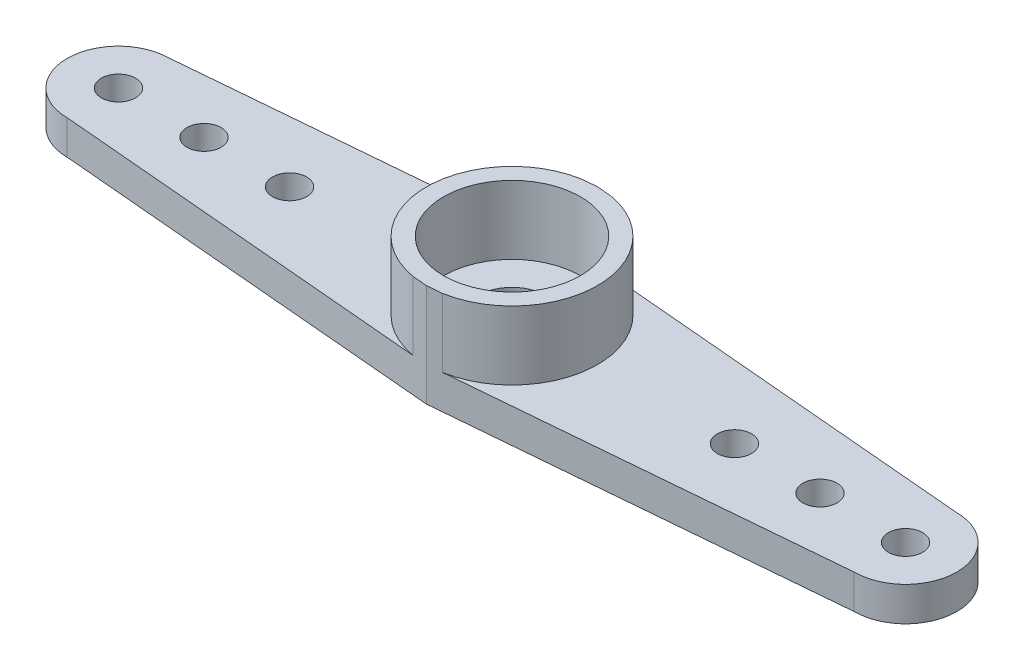
ISO-10303-21;
HEADER;
FILE_DESCRIPTION(('STEP AP214'),'2;1');
FILE_NAME('part.step','',(''),(''),'','','');
FILE_SCHEMA(('AUTOMOTIVE_DESIGN { 1 0 10303 214 1 1 1 1 }'));
ENDSEC;
DATA;
#1=APPLICATION_CONTEXT('core data for automotive mechanical design processes');
#2=APPLICATION_PROTOCOL_DEFINITION('international standard','automotive_design',2000,#1);
#3=PRODUCT_CONTEXT('',#1,'mechanical');
#4=PRODUCT('Part','Part','',(#3));
#5=PRODUCT_RELATED_PRODUCT_CATEGORY('part','',(#4));
#6=PRODUCT_DEFINITION_FORMATION('','',#4);
#7=PRODUCT_DEFINITION_CONTEXT('part definition',#1,'design');
#8=PRODUCT_DEFINITION('design','',#6,#7);
#9=PRODUCT_DEFINITION_SHAPE('','',#8);
#10=(LENGTH_UNIT() NAMED_UNIT(*) SI_UNIT(.MILLI.,.METRE.));
#11=(NAMED_UNIT(*) PLANE_ANGLE_UNIT() SI_UNIT($,.RADIAN.));
#12=(NAMED_UNIT(*) SI_UNIT($,.STERADIAN.) SOLID_ANGLE_UNIT());
#13=UNCERTAINTY_MEASURE_WITH_UNIT(LENGTH_MEASURE(1.E-05),#10,'distance_accuracy_value','');
#14=(GEOMETRIC_REPRESENTATION_CONTEXT(3) GLOBAL_UNCERTAINTY_ASSIGNED_CONTEXT((#13)) GLOBAL_UNIT_ASSIGNED_CONTEXT((#10,
#11,#12)) REPRESENTATION_CONTEXT('',''));
#15=CARTESIAN_POINT('',(0.,0.,0.));
#16=DIRECTION('',(0.,0.,1.));
#17=DIRECTION('',(1.,0.,0.));
#18=AXIS2_PLACEMENT_3D('',#15,#16,#17);
#19=CARTESIAN_POINT('',(0.,1.,0.));
#20=DIRECTION('',(0.,1.,0.));
#21=DIRECTION('',(0.,0.,1.));
#22=AXIS2_PLACEMENT_3D('',#19,#20,#21);
#23=PLANE('',#22);
#24=CARTESIAN_POINT('',(6.5,1.,0.));
#25=DIRECTION('',(0.,1.,0.));
#26=DIRECTION('',(0.,0.,1.));
#27=AXIS2_PLACEMENT_3D('',#24,#25,#26);
#28=CIRCLE('',#27,0.500000000000001);
#29=CARTESIAN_POINT('',(6.5,1.,0.500000000000001));
#30=VERTEX_POINT('',#29);
#31=EDGE_CURVE('E166',#30,#30,#28,.T.);
#32=ORIENTED_EDGE('',*,*,#31,.F.);
#33=EDGE_LOOP('',(#32));
#34=FACE_BOUND('',#33,.T.);
#35=CARTESIAN_POINT('',(9.,1.,0.));
#36=DIRECTION('',(0.,1.,0.));
#37=DIRECTION('',(0.,0.,1.));
#38=AXIS2_PLACEMENT_3D('',#35,#36,#37);
#39=CIRCLE('',#38,0.500000000000001);
#40=CARTESIAN_POINT('',(9.,1.,0.500000000000001));
#41=VERTEX_POINT('',#40);
#42=EDGE_CURVE('E169',#41,#41,#39,.T.);
#43=ORIENTED_EDGE('',*,*,#42,.F.);
#44=EDGE_LOOP('',(#43));
#45=FACE_BOUND('',#44,.T.);
#46=CARTESIAN_POINT('',(11.5,1.,0.));
#47=DIRECTION('',(0.,1.,0.));
#48=DIRECTION('',(0.,0.,1.));
#49=AXIS2_PLACEMENT_3D('',#46,#47,#48);
#50=CIRCLE('',#49,0.499999999999999);
#51=CARTESIAN_POINT('',(11.5,1.,0.499999999999999));
#52=VERTEX_POINT('',#51);
#53=EDGE_CURVE('E175',#52,#52,#50,.T.);
#54=ORIENTED_EDGE('',*,*,#53,.F.);
#55=EDGE_LOOP('',(#54));
#56=FACE_BOUND('',#55,.T.);
#57=DIRECTION('',(-0.996240588195683,0.,-0.0866296163648422));
#58=VECTOR('',#57,1.);
#59=CARTESIAN_POINT('',(0.215759849906192,1.,-2.4812382739212));
#60=LINE('',#59,#58);
#61=CARTESIAN_POINT('',(11.5,1.,-1.5));
#62=VERTEX_POINT('',#61);
#63=CARTESIAN_POINT('',(0.431519699812379,1.,-2.4624765478424));
#64=VERTEX_POINT('',#63);
#65=EDGE_CURVE('E51',#62,#64,#60,.T.);
#66=ORIENTED_EDGE('',*,*,#65,.T.);
#67=CARTESIAN_POINT('',(0.,1.,0.));
#68=DIRECTION('',(0.,1.,0.));
#69=DIRECTION('',(0.,0.,1.));
#70=AXIS2_PLACEMENT_3D('',#67,#68,#69);
#71=CIRCLE('',#70,2.5);
#72=CARTESIAN_POINT('',(0.431519699812379,1.,2.4624765478424));
#73=VERTEX_POINT('',#72);
#74=EDGE_CURVE('E55',#64,#73,#71,.F.);
#75=ORIENTED_EDGE('',*,*,#74,.T.);
#76=DIRECTION('',(0.996240588195683,0.,-0.0866296163648422));
#77=VECTOR('',#76,1.);
#78=CARTESIAN_POINT('',(0.215759849906192,1.,2.4812382739212));
#79=LINE('',#78,#77);
#80=CARTESIAN_POINT('',(11.5,1.,1.5));
#81=VERTEX_POINT('',#80);
#82=EDGE_CURVE('E136',#73,#81,#79,.T.);
#83=ORIENTED_EDGE('',*,*,#82,.T.);
#84=CARTESIAN_POINT('',(11.5,1.,0.));
#85=DIRECTION('',(0.,1.,0.));
#86=DIRECTION('',(0.,0.,1.));
#87=AXIS2_PLACEMENT_3D('',#84,#85,#86);
#88=CIRCLE('',#87,1.5);
#89=EDGE_CURVE('E154',#81,#62,#88,.T.);
#90=ORIENTED_EDGE('',*,*,#89,.T.);
#91=EDGE_LOOP('',(#66,#75,#83,#90));
#92=FACE_BOUND('',#91,.T.);
#93=ADVANCED_FACE('F35',(#34,#45,#56,#92),#23,.T.);
#94=CARTESIAN_POINT('',(-6.5,1.,0.));
#95=DIRECTION('',(0.,1.,0.));
#96=DIRECTION('',(0.,0.,1.));
#97=AXIS2_PLACEMENT_3D('',#94,#95,#96);
#98=CIRCLE('',#97,0.500000000000001);
#99=CARTESIAN_POINT('',(-6.5,1.,0.499999999999955));
#100=VERTEX_POINT('',#99);
#101=EDGE_CURVE('E157',#100,#100,#98,.T.);
#102=ORIENTED_EDGE('',*,*,#101,.F.);
#103=EDGE_LOOP('',(#102));
#104=FACE_BOUND('',#103,.T.);
#105=CARTESIAN_POINT('',(-9.,1.,0.));
#106=DIRECTION('',(0.,1.,0.));
#107=DIRECTION('',(0.,0.,1.));
#108=AXIS2_PLACEMENT_3D('',#105,#106,#107);
#109=CIRCLE('',#108,0.500000000000001);
#110=CARTESIAN_POINT('',(-9.,1.,0.499999999999939));
#111=VERTEX_POINT('',#110);
#112=EDGE_CURVE('E160',#111,#111,#109,.T.);
#113=ORIENTED_EDGE('',*,*,#112,.F.);
#114=EDGE_LOOP('',(#113));
#115=FACE_BOUND('',#114,.T.);
#116=CARTESIAN_POINT('',(-11.5,1.,0.));
#117=DIRECTION('',(0.,1.,0.));
#118=DIRECTION('',(0.,0.,1.));
#119=AXIS2_PLACEMENT_3D('',#116,#117,#118);
#120=CIRCLE('',#119,0.499999999999998);
#121=CARTESIAN_POINT('',(-11.5,1.,0.499999999999918));
#122=VERTEX_POINT('',#121);
#123=EDGE_CURVE('E163',#122,#122,#120,.T.);
#124=ORIENTED_EDGE('',*,*,#123,.F.);
#125=EDGE_LOOP('',(#124));
#126=FACE_BOUND('',#125,.T.);
#127=DIRECTION('',(0.996240588195683,0.,0.0866296163648423));
#128=VECTOR('',#127,1.);
#129=CARTESIAN_POINT('',(-0.215759849906192,1.,2.4812382739212));
#130=LINE('',#129,#128);
#131=CARTESIAN_POINT('',(-11.5,1.,1.49999999999996));
#132=VERTEX_POINT('',#131);
#133=CARTESIAN_POINT('',(-0.431519699812375,1.,2.4624765478424));
#134=VERTEX_POINT('',#133);
#135=EDGE_CURVE('E151',#132,#134,#130,.T.);
#136=ORIENTED_EDGE('',*,*,#135,.T.);
#137=CARTESIAN_POINT('',(0.,1.,0.));
#138=DIRECTION('',(0.,1.,0.));
#139=DIRECTION('',(0.,0.,1.));
#140=AXIS2_PLACEMENT_3D('',#137,#138,#139);
#141=CIRCLE('',#140,2.5);
#142=CARTESIAN_POINT('',(-0.431519699812379,1.,-2.4624765478424));
#143=VERTEX_POINT('',#142);
#144=EDGE_CURVE('E137',#134,#143,#141,.F.);
#145=ORIENTED_EDGE('',*,*,#144,.T.);
#146=DIRECTION('',(-0.996240588195683,0.,0.0866296163648421));
#147=VECTOR('',#146,1.);
#148=CARTESIAN_POINT('',(-0.215759849906192,1.,-2.4812382739212));
#149=LINE('',#148,#147);
#150=CARTESIAN_POINT('',(-11.5,1.,-1.50000000000004));
#151=VERTEX_POINT('',#150);
#152=EDGE_CURVE('E146',#143,#151,#149,.T.);
#153=ORIENTED_EDGE('',*,*,#152,.T.);
#154=CARTESIAN_POINT('',(-11.5,1.,0.));
#155=DIRECTION('',(0.,1.,0.));
#156=DIRECTION('',(0.,0.,1.));
#157=AXIS2_PLACEMENT_3D('',#154,#155,#156);
#158=CIRCLE('',#157,1.5);
#159=EDGE_CURVE('E148',#151,#132,#158,.T.);
#160=ORIENTED_EDGE('',*,*,#159,.T.);
#161=EDGE_LOOP('',(#136,#145,#153,#160));
#162=FACE_BOUND('',#161,.T.);
#163=ADVANCED_FACE('F263',(#104,#115,#126,#162),#23,.T.);
#164=CARTESIAN_POINT('',(-0.215759849906192,1.,-2.4812382739212));
#165=DIRECTION('',(0.0866296163648421,0.,0.996240588195683));
#166=DIRECTION('',(0.996240588195683,0.,-0.0866296163648421));
#167=AXIS2_PLACEMENT_3D('',#164,#165,#166);
#168=PLANE('',#167);
#169=DIRECTION('',(-0.996240588195683,0.,0.0866296163648421));
#170=VECTOR('',#169,1.);
#171=CARTESIAN_POINT('',(-0.215759849906192,0.,-2.4812382739212));
#172=LINE('',#171,#170);
#173=CARTESIAN_POINT('',(0.,0.,-2.5));
#174=VERTEX_POINT('',#173);
#175=CARTESIAN_POINT('',(-11.5,0.,-1.50000000000004));
#176=VERTEX_POINT('',#175);
#177=EDGE_CURVE('E145',#174,#176,#172,.T.);
#178=ORIENTED_EDGE('',*,*,#177,.T.);
#179=DIRECTION('',(0.,-1.,0.));
#180=VECTOR('',#179,1.);
#181=CARTESIAN_POINT('',(-11.5,1.,-1.50000000000004));
#182=LINE('',#181,#180);
#183=EDGE_CURVE('E39',#151,#176,#182,.T.);
#184=ORIENTED_EDGE('',*,*,#183,.F.);
#185=ORIENTED_EDGE('',*,*,#152,.F.);
#186=DIRECTION('',(0.,-1.,0.));
#187=VECTOR('',#186,1.);
#188=CARTESIAN_POINT('',(-0.431519699812379,3.,-2.4624765478424));
#189=LINE('',#188,#187);
#190=CARTESIAN_POINT('',(-0.431519699812379,3.,-2.4624765478424));
#191=VERTEX_POINT('',#190);
#192=EDGE_CURVE('E140',#191,#143,#189,.T.);
#193=ORIENTED_EDGE('',*,*,#192,.F.);
#194=DIRECTION('',(-0.996240588195683,0.,0.0866296163648421));
#195=VECTOR('',#194,1.);
#196=CARTESIAN_POINT('',(-0.215759849906192,3.,-2.4812382739212));
#197=LINE('',#196,#195);
#198=CARTESIAN_POINT('',(0.,3.,-2.5));
#199=VERTEX_POINT('',#198);
#200=EDGE_CURVE('E250',#199,#191,#197,.T.);
#201=ORIENTED_EDGE('',*,*,#200,.F.);
#202=DIRECTION('',(0.,-1.,0.));
#203=VECTOR('',#202,1.);
#204=CARTESIAN_POINT('',(0.,1.,-2.5));
#205=LINE('',#204,#203);
#206=EDGE_CURVE('E178',#199,#174,#205,.T.);
#207=ORIENTED_EDGE('',*,*,#206,.T.);
#208=EDGE_LOOP('',(#178,#184,#185,#193,#201,#207));
#209=FACE_BOUND('',#208,.T.);
#210=ADVANCED_FACE('F37',(#209),#168,.F.);
#211=CARTESIAN_POINT('',(-11.5,1.,0.));
#212=DIRECTION('',(0.,-1.,0.));
#213=DIRECTION('',(0.,0.,-1.));
#214=AXIS2_PLACEMENT_3D('',#211,#212,#213);
#215=CYLINDRICAL_SURFACE('',#214,1.5);
#216=CARTESIAN_POINT('',(-11.5,0.,0.));
#217=DIRECTION('',(0.,1.,0.));
#218=DIRECTION('',(0.,0.,1.));
#219=AXIS2_PLACEMENT_3D('',#216,#217,#218);
#220=CIRCLE('',#219,1.5);
#221=CARTESIAN_POINT('',(-11.5,0.,1.49999999999996));
#222=VERTEX_POINT('',#221);
#223=EDGE_CURVE('E180',#176,#222,#220,.T.);
#224=ORIENTED_EDGE('',*,*,#223,.T.);
#225=DIRECTION('',(0.,-1.,0.));
#226=VECTOR('',#225,1.);
#227=CARTESIAN_POINT('',(-11.5,1.,1.49999999999996));
#228=LINE('',#227,#226);
#229=EDGE_CURVE('E219',#132,#222,#228,.T.);
#230=ORIENTED_EDGE('',*,*,#229,.F.);
#231=ORIENTED_EDGE('',*,*,#159,.F.);
#232=ORIENTED_EDGE('',*,*,#183,.T.);
#233=EDGE_LOOP('',(#224,#230,#231,#232));
#234=FACE_BOUND('',#233,.T.);
#235=ADVANCED_FACE('F229',(#234),#215,.T.);
#236=CARTESIAN_POINT('',(-0.215759849906192,1.,2.4812382739212));
#237=DIRECTION('',(0.0866296163648423,0.,-0.996240588195683));
#238=DIRECTION('',(-0.996240588195683,0.,-0.0866296163648423));
#239=AXIS2_PLACEMENT_3D('',#236,#237,#238);
#240=PLANE('',#239);
#241=DIRECTION('',(0.,-1.,0.));
#242=VECTOR('',#241,1.);
#243=CARTESIAN_POINT('',(0.,1.,2.5));
#244=LINE('',#243,#242);
#245=CARTESIAN_POINT('',(0.,3.,2.5));
#246=VERTEX_POINT('',#245);
#247=CARTESIAN_POINT('',(0.,0.,2.5));
#248=VERTEX_POINT('',#247);
#249=EDGE_CURVE('E218',#246,#248,#244,.T.);
#250=ORIENTED_EDGE('',*,*,#249,.F.);
#251=DIRECTION('',(0.996240588195683,0.,0.0866296163648423));
#252=VECTOR('',#251,1.);
#253=CARTESIAN_POINT('',(-0.215759849906192,3.,2.4812382739212));
#254=LINE('',#253,#252);
#255=CARTESIAN_POINT('',(-0.431519699812375,3.,2.46247654784241));
#256=VERTEX_POINT('',#255);
#257=EDGE_CURVE('E129',#256,#246,#254,.T.);
#258=ORIENTED_EDGE('',*,*,#257,.F.);
#259=DIRECTION('',(0.,-1.,0.));
#260=VECTOR('',#259,1.);
#261=CARTESIAN_POINT('',(-0.431519699812375,3.,2.46247654784241));
#262=LINE('',#261,#260);
#263=EDGE_CURVE('E255',#256,#134,#262,.T.);
#264=ORIENTED_EDGE('',*,*,#263,.T.);
#265=ORIENTED_EDGE('',*,*,#135,.F.);
#266=ORIENTED_EDGE('',*,*,#229,.T.);
#267=DIRECTION('',(0.996240588195683,0.,0.0866296163648423));
#268=VECTOR('',#267,1.);
#269=CARTESIAN_POINT('',(-0.215759849906192,0.,2.4812382739212));
#270=LINE('',#269,#268);
#271=EDGE_CURVE('E182',#222,#248,#270,.T.);
#272=ORIENTED_EDGE('',*,*,#271,.T.);
#273=EDGE_LOOP('',(#250,#258,#264,#265,#266,#272));
#274=FACE_BOUND('',#273,.T.);
#275=ADVANCED_FACE('F243',(#274),#240,.F.);
#276=CARTESIAN_POINT('',(0.215759849906192,1.,2.4812382739212));
#277=DIRECTION('',(-0.0866296163648422,0.,-0.996240588195683));
#278=DIRECTION('',(-0.996240588195683,0.,0.0866296163648422));
#279=AXIS2_PLACEMENT_3D('',#276,#277,#278);
#280=PLANE('',#279);
#281=DIRECTION('',(0.996240588195683,0.,-0.0866296163648422));
#282=VECTOR('',#281,1.);
#283=CARTESIAN_POINT('',(0.215759849906192,0.,2.4812382739212));
#284=LINE('',#283,#282);
#285=CARTESIAN_POINT('',(11.5,0.,1.5));
#286=VERTEX_POINT('',#285);
#287=EDGE_CURVE('E184',#248,#286,#284,.T.);
#288=ORIENTED_EDGE('',*,*,#287,.T.);
#289=DIRECTION('',(0.,-1.,0.));
#290=VECTOR('',#289,1.);
#291=CARTESIAN_POINT('',(11.5,1.,1.5));
#292=LINE('',#291,#290);
#293=EDGE_CURVE('E215',#81,#286,#292,.T.);
#294=ORIENTED_EDGE('',*,*,#293,.F.);
#295=ORIENTED_EDGE('',*,*,#82,.F.);
#296=DIRECTION('',(0.,-1.,0.));
#297=VECTOR('',#296,1.);
#298=CARTESIAN_POINT('',(0.431519699812379,3.,2.4624765478424));
#299=LINE('',#298,#297);
#300=CARTESIAN_POINT('',(0.431519699812379,3.,2.4624765478424));
#301=VERTEX_POINT('',#300);
#302=EDGE_CURVE('E115',#301,#73,#299,.T.);
#303=ORIENTED_EDGE('',*,*,#302,.F.);
#304=DIRECTION('',(0.996240588195683,0.,-0.0866296163648422));
#305=VECTOR('',#304,1.);
#306=CARTESIAN_POINT('',(0.215759849906192,3.,2.4812382739212));
#307=LINE('',#306,#305);
#308=EDGE_CURVE('E122',#246,#301,#307,.T.);
#309=ORIENTED_EDGE('',*,*,#308,.F.);
#310=ORIENTED_EDGE('',*,*,#249,.T.);
#311=EDGE_LOOP('',(#288,#294,#295,#303,#309,#310));
#312=FACE_BOUND('',#311,.T.);
#313=ADVANCED_FACE('F134',(#312),#280,.F.);
#314=CARTESIAN_POINT('',(11.5,1.,0.));
#315=DIRECTION('',(0.,-1.,0.));
#316=DIRECTION('',(0.,0.,-1.));
#317=AXIS2_PLACEMENT_3D('',#314,#315,#316);
#318=CYLINDRICAL_SURFACE('',#317,1.5);
#319=CARTESIAN_POINT('',(11.5,0.,0.));
#320=DIRECTION('',(0.,1.,0.));
#321=DIRECTION('',(0.,0.,1.));
#322=AXIS2_PLACEMENT_3D('',#319,#320,#321);
#323=CIRCLE('',#322,1.5);
#324=CARTESIAN_POINT('',(11.5,0.,-1.5));
#325=VERTEX_POINT('',#324);
#326=EDGE_CURVE('E186',#286,#325,#323,.T.);
#327=ORIENTED_EDGE('',*,*,#326,.T.);
#328=DIRECTION('',(0.,-1.,0.));
#329=VECTOR('',#328,1.);
#330=CARTESIAN_POINT('',(11.5,1.,-1.5));
#331=LINE('',#330,#329);
#332=EDGE_CURVE('E212',#62,#325,#331,.T.);
#333=ORIENTED_EDGE('',*,*,#332,.F.);
#334=ORIENTED_EDGE('',*,*,#89,.F.);
#335=ORIENTED_EDGE('',*,*,#293,.T.);
#336=EDGE_LOOP('',(#327,#333,#334,#335));
#337=FACE_BOUND('',#336,.T.);
#338=ADVANCED_FACE('F246',(#337),#318,.T.);
#339=CARTESIAN_POINT('',(0.,1.,0.));
#340=DIRECTION('',(0.,-1.,0.));
#341=DIRECTION('',(0.,0.,-1.));
#342=AXIS2_PLACEMENT_3D('',#339,#340,#341);
#343=CYLINDRICAL_SURFACE('',#342,1.);
#344=CARTESIAN_POINT('',(0.,1.,0.));
#345=DIRECTION('',(0.,1.,0.));
#346=DIRECTION('',(0.,0.,1.));
#347=AXIS2_PLACEMENT_3D('',#344,#345,#346);
#348=CIRCLE('',#347,1.);
#349=CARTESIAN_POINT('',(0.,1.,1.));
#350=VERTEX_POINT('',#349);
#351=EDGE_CURVE('E172',#350,#350,#348,.T.);
#352=ORIENTED_EDGE('',*,*,#351,.T.);
#353=EDGE_LOOP('',(#352));
#354=FACE_BOUND('',#353,.T.);
#355=CARTESIAN_POINT('',(0.,0.,0.));
#356=DIRECTION('',(0.,1.,0.));
#357=DIRECTION('',(0.,0.,1.));
#358=AXIS2_PLACEMENT_3D('',#355,#356,#357);
#359=CIRCLE('',#358,1.);
#360=CARTESIAN_POINT('',(0.,0.,1.));
#361=VERTEX_POINT('',#360);
#362=EDGE_CURVE('E205',#361,#361,#359,.T.);
#363=ORIENTED_EDGE('',*,*,#362,.F.);
#364=EDGE_LOOP('',(#363));
#365=FACE_BOUND('',#364,.T.);
#366=ADVANCED_FACE('F291',(#354,#365),#343,.F.);
#367=CARTESIAN_POINT('',(9.,1.,0.));
#368=DIRECTION('',(0.,-1.,0.));
#369=DIRECTION('',(0.,0.,-1.));
#370=AXIS2_PLACEMENT_3D('',#367,#368,#369);
#371=CYLINDRICAL_SURFACE('',#370,0.500000000000001);
#372=ORIENTED_EDGE('',*,*,#42,.T.);
#373=EDGE_LOOP('',(#372));
#374=FACE_BOUND('',#373,.T.);
#375=CARTESIAN_POINT('',(9.,0.,0.));
#376=DIRECTION('',(0.,1.,0.));
#377=DIRECTION('',(0.,0.,1.));
#378=AXIS2_PLACEMENT_3D('',#375,#376,#377);
#379=CIRCLE('',#378,0.500000000000001);
#380=CARTESIAN_POINT('',(9.,0.,0.500000000000001));
#381=VERTEX_POINT('',#380);
#382=EDGE_CURVE('E202',#381,#381,#379,.T.);
#383=ORIENTED_EDGE('',*,*,#382,.F.);
#384=EDGE_LOOP('',(#383));
#385=FACE_BOUND('',#384,.T.);
#386=ADVANCED_FACE('F294',(#374,#385),#371,.F.);
#387=CARTESIAN_POINT('',(6.5,1.,0.));
#388=DIRECTION('',(0.,-1.,0.));
#389=DIRECTION('',(0.,0.,-1.));
#390=AXIS2_PLACEMENT_3D('',#387,#388,#389);
#391=CYLINDRICAL_SURFACE('',#390,0.500000000000001);
#392=ORIENTED_EDGE('',*,*,#31,.T.);
#393=EDGE_LOOP('',(#392));
#394=FACE_BOUND('',#393,.T.);
#395=CARTESIAN_POINT('',(6.5,0.,0.));
#396=DIRECTION('',(0.,1.,0.));
#397=DIRECTION('',(0.,0.,1.));
#398=AXIS2_PLACEMENT_3D('',#395,#396,#397);
#399=CIRCLE('',#398,0.500000000000001);
#400=CARTESIAN_POINT('',(6.5,0.,0.500000000000001));
#401=VERTEX_POINT('',#400);
#402=EDGE_CURVE('E199',#401,#401,#399,.T.);
#403=ORIENTED_EDGE('',*,*,#402,.F.);
#404=EDGE_LOOP('',(#403));
#405=FACE_BOUND('',#404,.T.);
#406=ADVANCED_FACE('F301',(#394,#405),#391,.F.);
#407=CARTESIAN_POINT('',(-11.5,1.,0.));
#408=DIRECTION('',(0.,-1.,0.));
#409=DIRECTION('',(0.,0.,-1.));
#410=AXIS2_PLACEMENT_3D('',#407,#408,#409);
#411=CYLINDRICAL_SURFACE('',#410,0.499999999999998);
#412=ORIENTED_EDGE('',*,*,#123,.T.);
#413=EDGE_LOOP('',(#412));
#414=FACE_BOUND('',#413,.T.);
#415=CARTESIAN_POINT('',(-11.5,0.,0.));
#416=DIRECTION('',(0.,1.,0.));
#417=DIRECTION('',(0.,0.,1.));
#418=AXIS2_PLACEMENT_3D('',#415,#416,#417);
#419=CIRCLE('',#418,0.499999999999998);
#420=CARTESIAN_POINT('',(-11.5,0.,0.499999999999918));
#421=VERTEX_POINT('',#420);
#422=EDGE_CURVE('E196',#421,#421,#419,.T.);
#423=ORIENTED_EDGE('',*,*,#422,.F.);
#424=EDGE_LOOP('',(#423));
#425=FACE_BOUND('',#424,.T.);
#426=ADVANCED_FACE('F308',(#414,#425),#411,.F.);
#427=CARTESIAN_POINT('',(-9.,1.,0.));
#428=DIRECTION('',(0.,-1.,0.));
#429=DIRECTION('',(0.,0.,-1.));
#430=AXIS2_PLACEMENT_3D('',#427,#428,#429);
#431=CYLINDRICAL_SURFACE('',#430,0.500000000000001);
#432=ORIENTED_EDGE('',*,*,#112,.T.);
#433=EDGE_LOOP('',(#432));
#434=FACE_BOUND('',#433,.T.);
#435=CARTESIAN_POINT('',(-9.,0.,0.));
#436=DIRECTION('',(0.,1.,0.));
#437=DIRECTION('',(0.,0.,1.));
#438=AXIS2_PLACEMENT_3D('',#435,#436,#437);
#439=CIRCLE('',#438,0.500000000000001);
#440=CARTESIAN_POINT('',(-9.,0.,0.499999999999939));
#441=VERTEX_POINT('',#440);
#442=EDGE_CURVE('E193',#441,#441,#439,.T.);
#443=ORIENTED_EDGE('',*,*,#442,.F.);
#444=EDGE_LOOP('',(#443));
#445=FACE_BOUND('',#444,.T.);
#446=ADVANCED_FACE('F312',(#434,#445),#431,.F.);
#447=CARTESIAN_POINT('',(-6.5,1.,0.));
#448=DIRECTION('',(0.,-1.,0.));
#449=DIRECTION('',(0.,0.,-1.));
#450=AXIS2_PLACEMENT_3D('',#447,#448,#449);
#451=CYLINDRICAL_SURFACE('',#450,0.500000000000001);
#452=ORIENTED_EDGE('',*,*,#101,.T.);
#453=EDGE_LOOP('',(#452));
#454=FACE_BOUND('',#453,.T.);
#455=CARTESIAN_POINT('',(-6.5,0.,0.));
#456=DIRECTION('',(0.,1.,0.));
#457=DIRECTION('',(0.,0.,1.));
#458=AXIS2_PLACEMENT_3D('',#455,#456,#457);
#459=CIRCLE('',#458,0.500000000000001);
#460=CARTESIAN_POINT('',(-6.5,0.,0.499999999999955));
#461=VERTEX_POINT('',#460);
#462=EDGE_CURVE('E190',#461,#461,#459,.T.);
#463=ORIENTED_EDGE('',*,*,#462,.F.);
#464=EDGE_LOOP('',(#463));
#465=FACE_BOUND('',#464,.T.);
#466=ADVANCED_FACE('F316',(#454,#465),#451,.F.);
#467=CARTESIAN_POINT('',(0.215759849906192,1.,-2.4812382739212));
#468=DIRECTION('',(-0.0866296163648422,0.,0.996240588195683));
#469=DIRECTION('',(0.996240588195683,0.,0.0866296163648422));
#470=AXIS2_PLACEMENT_3D('',#467,#468,#469);
#471=PLANE('',#470);
#472=ORIENTED_EDGE('',*,*,#206,.F.);
#473=DIRECTION('',(-0.996240588195683,0.,-0.0866296163648422));
#474=VECTOR('',#473,1.);
#475=CARTESIAN_POINT('',(0.215759849906192,3.,-2.4812382739212));
#476=LINE('',#475,#474);
#477=CARTESIAN_POINT('',(0.431519699812379,3.,-2.4624765478424));
#478=VERTEX_POINT('',#477);
#479=EDGE_CURVE('E121',#478,#199,#476,.T.);
#480=ORIENTED_EDGE('',*,*,#479,.F.);
#481=DIRECTION('',(0.,-1.,0.));
#482=VECTOR('',#481,1.);
#483=CARTESIAN_POINT('',(0.431519699812379,3.,-2.4624765478424));
#484=LINE('',#483,#482);
#485=EDGE_CURVE('E117',#478,#64,#484,.T.);
#486=ORIENTED_EDGE('',*,*,#485,.T.);
#487=ORIENTED_EDGE('',*,*,#65,.F.);
#488=ORIENTED_EDGE('',*,*,#332,.T.);
#489=DIRECTION('',(-0.996240588195683,0.,-0.0866296163648422));
#490=VECTOR('',#489,1.);
#491=CARTESIAN_POINT('',(0.215759849906192,0.,-2.4812382739212));
#492=LINE('',#491,#490);
#493=EDGE_CURVE('E188',#325,#174,#492,.T.);
#494=ORIENTED_EDGE('',*,*,#493,.T.);
#495=EDGE_LOOP('',(#472,#480,#486,#487,#488,#494));
#496=FACE_BOUND('',#495,.T.);
#497=ADVANCED_FACE('F249',(#496),#471,.F.);
#498=CARTESIAN_POINT('',(11.5,1.,0.));
#499=DIRECTION('',(0.,-1.,0.));
#500=DIRECTION('',(0.,0.,-1.));
#501=AXIS2_PLACEMENT_3D('',#498,#499,#500);
#502=CYLINDRICAL_SURFACE('',#501,0.499999999999999);
#503=ORIENTED_EDGE('',*,*,#53,.T.);
#504=EDGE_LOOP('',(#503));
#505=FACE_BOUND('',#504,.T.);
#506=CARTESIAN_POINT('',(11.5,0.,0.));
#507=DIRECTION('',(0.,1.,0.));
#508=DIRECTION('',(0.,0.,1.));
#509=AXIS2_PLACEMENT_3D('',#506,#507,#508);
#510=CIRCLE('',#509,0.499999999999999);
#511=CARTESIAN_POINT('',(11.5,0.,0.499999999999999));
#512=VERTEX_POINT('',#511);
#513=EDGE_CURVE('E149',#512,#512,#510,.T.);
#514=ORIENTED_EDGE('',*,*,#513,.F.);
#515=EDGE_LOOP('',(#514));
#516=FACE_BOUND('',#515,.T.);
#517=ADVANCED_FACE('F278',(#505,#516),#502,.F.);
#518=CARTESIAN_POINT('',(0.,1.,0.));
#519=DIRECTION('',(0.,1.,0.));
#520=DIRECTION('',(0.,0.,1.));
#521=AXIS2_PLACEMENT_3D('',#518,#519,#520);
#522=CIRCLE('',#521,2.);
#523=CARTESIAN_POINT('',(0.,1.,2.));
#524=VERTEX_POINT('',#523);
#525=EDGE_CURVE('E11',#524,#524,#522,.F.);
#526=ORIENTED_EDGE('',*,*,#525,.F.);
#527=EDGE_LOOP('',(#526));
#528=FACE_BOUND('',#527,.T.);
#529=ORIENTED_EDGE('',*,*,#351,.F.);
#530=EDGE_LOOP('',(#529));
#531=FACE_BOUND('',#530,.T.);
#532=ADVANCED_FACE('F267',(#528,#531),#23,.T.);
#533=CARTESIAN_POINT('',(0.,0.,0.));
#534=DIRECTION('',(0.,1.,0.));
#535=DIRECTION('',(0.,0.,1.));
#536=AXIS2_PLACEMENT_3D('',#533,#534,#535);
#537=PLANE('',#536);
#538=ORIENTED_EDGE('',*,*,#362,.T.);
#539=EDGE_LOOP('',(#538));
#540=FACE_BOUND('',#539,.T.);
#541=ORIENTED_EDGE('',*,*,#177,.F.);
#542=ORIENTED_EDGE('',*,*,#493,.F.);
#543=ORIENTED_EDGE('',*,*,#326,.F.);
#544=ORIENTED_EDGE('',*,*,#287,.F.);
#545=ORIENTED_EDGE('',*,*,#271,.F.);
#546=ORIENTED_EDGE('',*,*,#223,.F.);
#547=EDGE_LOOP('',(#541,#542,#543,#544,#545,#546));
#548=FACE_BOUND('',#547,.T.);
#549=ORIENTED_EDGE('',*,*,#462,.T.);
#550=EDGE_LOOP('',(#549));
#551=FACE_BOUND('',#550,.T.);
#552=ORIENTED_EDGE('',*,*,#442,.T.);
#553=EDGE_LOOP('',(#552));
#554=FACE_BOUND('',#553,.T.);
#555=ORIENTED_EDGE('',*,*,#422,.T.);
#556=EDGE_LOOP('',(#555));
#557=FACE_BOUND('',#556,.T.);
#558=ORIENTED_EDGE('',*,*,#402,.T.);
#559=EDGE_LOOP('',(#558));
#560=FACE_BOUND('',#559,.T.);
#561=ORIENTED_EDGE('',*,*,#382,.T.);
#562=EDGE_LOOP('',(#561));
#563=FACE_BOUND('',#562,.T.);
#564=ORIENTED_EDGE('',*,*,#513,.T.);
#565=EDGE_LOOP('',(#564));
#566=FACE_BOUND('',#565,.T.);
#567=ADVANCED_FACE('F239',(#540,#548,#551,#554,#557,#560,#563,#566),#537,.F.);
#568=CARTESIAN_POINT('',(0.,3.,0.));
#569=DIRECTION('',(0.,-1.,0.));
#570=DIRECTION('',(0.,0.,-1.));
#571=AXIS2_PLACEMENT_3D('',#568,#569,#570);
#572=CYLINDRICAL_SURFACE('',#571,2.5);
#573=ORIENTED_EDGE('',*,*,#74,.F.);
#574=ORIENTED_EDGE('',*,*,#485,.F.);
#575=CARTESIAN_POINT('',(0.,3.,0.));
#576=DIRECTION('',(0.,1.,0.));
#577=DIRECTION('',(0.,0.,1.));
#578=AXIS2_PLACEMENT_3D('',#575,#576,#577);
#579=CIRCLE('',#578,2.5);
#580=EDGE_CURVE('E111',#301,#478,#579,.T.);
#581=ORIENTED_EDGE('',*,*,#580,.F.);
#582=ORIENTED_EDGE('',*,*,#302,.T.);
#583=EDGE_LOOP('',(#573,#574,#581,#582));
#584=FACE_BOUND('',#583,.T.);
#585=ADVANCED_FACE('F113',(#584),#572,.T.);
#586=ORIENTED_EDGE('',*,*,#144,.F.);
#587=ORIENTED_EDGE('',*,*,#263,.F.);
#588=EDGE_CURVE('E124',#191,#256,#579,.T.);
#589=ORIENTED_EDGE('',*,*,#588,.F.);
#590=ORIENTED_EDGE('',*,*,#192,.T.);
#591=EDGE_LOOP('',(#586,#587,#589,#590));
#592=FACE_BOUND('',#591,.T.);
#593=ADVANCED_FACE('F260',(#592),#572,.T.);
#594=CARTESIAN_POINT('',(0.,3.,0.));
#595=DIRECTION('',(0.,-1.,0.));
#596=DIRECTION('',(0.,0.,-1.));
#597=AXIS2_PLACEMENT_3D('',#594,#595,#596);
#598=CYLINDRICAL_SURFACE('',#597,2.);
#599=ORIENTED_EDGE('',*,*,#525,.T.);
#600=EDGE_LOOP('',(#599));
#601=FACE_BOUND('',#600,.T.);
#602=CARTESIAN_POINT('',(0.,3.,0.));
#603=DIRECTION('',(0.,1.,0.));
#604=DIRECTION('',(0.,0.,1.));
#605=AXIS2_PLACEMENT_3D('',#602,#603,#604);
#606=CIRCLE('',#605,2.);
#607=CARTESIAN_POINT('',(0.,3.,2.));
#608=VERTEX_POINT('',#607);
#609=EDGE_CURVE('E132',#608,#608,#606,.T.);
#610=ORIENTED_EDGE('',*,*,#609,.T.);
#611=EDGE_LOOP('',(#610));
#612=FACE_BOUND('',#611,.T.);
#613=ADVANCED_FACE('F440',(#601,#612),#598,.F.);
#614=CARTESIAN_POINT('',(0.,3.,0.));
#615=DIRECTION('',(0.,1.,0.));
#616=DIRECTION('',(0.,0.,1.));
#617=AXIS2_PLACEMENT_3D('',#614,#615,#616);
#618=PLANE('',#617);
#619=ORIENTED_EDGE('',*,*,#609,.F.);
#620=EDGE_LOOP('',(#619));
#621=FACE_BOUND('',#620,.T.);
#622=ORIENTED_EDGE('',*,*,#308,.T.);
#623=ORIENTED_EDGE('',*,*,#580,.T.);
#624=ORIENTED_EDGE('',*,*,#479,.T.);
#625=ORIENTED_EDGE('',*,*,#200,.T.);
#626=ORIENTED_EDGE('',*,*,#588,.T.);
#627=ORIENTED_EDGE('',*,*,#257,.T.);
#628=EDGE_LOOP('',(#622,#623,#624,#625,#626,#627));
#629=FACE_BOUND('',#628,.T.);
#630=ADVANCED_FACE('F127',(#621,#629),#618,.T.);
#631=CLOSED_SHELL('',(#93,#163,#210,#235,#275,#313,#338,#366,#386,#406,#426,#446,#466,#497,#517,
#532,#567,#585,#593,#613,#630));
#632=MANIFOLD_SOLID_BREP('B2',#631);
#633=ADVANCED_BREP_SHAPE_REPRESENTATION('',(#18,#632),#14);
#634=SHAPE_DEFINITION_REPRESENTATION(#9,#633);
ENDSEC;
END-ISO-10303-21;
